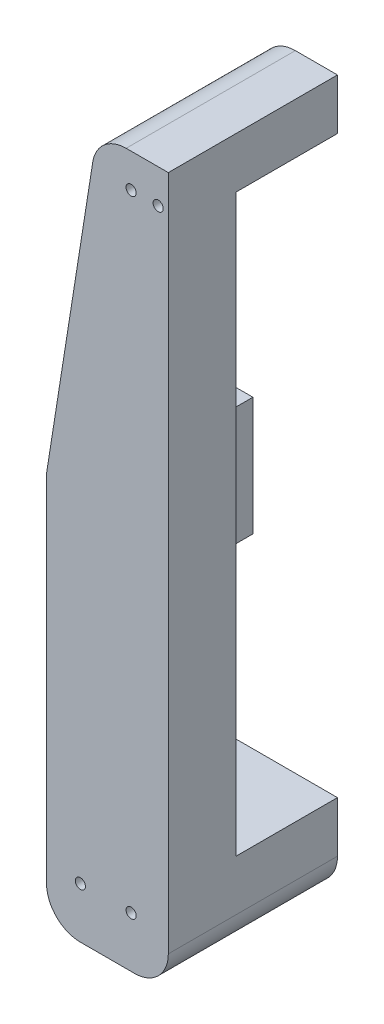
ISO-10303-21;
HEADER;
FILE_DESCRIPTION(('STEP AP214'),'2;1');
FILE_NAME('part.step','',(''),(''),'','','');
FILE_SCHEMA(('AUTOMOTIVE_DESIGN { 1 0 10303 214 1 1 1 1 }'));
ENDSEC;
DATA;
#1=APPLICATION_CONTEXT('core data for automotive mechanical design processes');
#2=APPLICATION_PROTOCOL_DEFINITION('international standard','automotive_design',2000,#1);
#3=PRODUCT_CONTEXT('',#1,'mechanical');
#4=PRODUCT('Part','Part','',(#3));
#5=PRODUCT_RELATED_PRODUCT_CATEGORY('part','',(#4));
#6=PRODUCT_DEFINITION_FORMATION('','',#4);
#7=PRODUCT_DEFINITION_CONTEXT('part definition',#1,'design');
#8=PRODUCT_DEFINITION('design','',#6,#7);
#9=PRODUCT_DEFINITION_SHAPE('','',#8);
#10=(LENGTH_UNIT() NAMED_UNIT(*) SI_UNIT(.MILLI.,.METRE.));
#11=(NAMED_UNIT(*) PLANE_ANGLE_UNIT() SI_UNIT($,.RADIAN.));
#12=(NAMED_UNIT(*) SI_UNIT($,.STERADIAN.) SOLID_ANGLE_UNIT());
#13=UNCERTAINTY_MEASURE_WITH_UNIT(LENGTH_MEASURE(1.E-05),#10,'distance_accuracy_value','');
#14=(GEOMETRIC_REPRESENTATION_CONTEXT(3) GLOBAL_UNCERTAINTY_ASSIGNED_CONTEXT((#13)) GLOBAL_UNIT_ASSIGNED_CONTEXT((#10,
#11,#12)) REPRESENTATION_CONTEXT('',''));
#15=CARTESIAN_POINT('',(0.,0.,0.));
#16=DIRECTION('',(0.,0.,1.));
#17=DIRECTION('',(1.,0.,0.));
#18=AXIS2_PLACEMENT_3D('',#15,#16,#17);
#19=CARTESIAN_POINT('',(0.,0.,0.));
#20=DIRECTION('',(0.,0.,1.));
#21=DIRECTION('',(1.,0.,0.));
#22=AXIS2_PLACEMENT_3D('',#19,#20,#21);
#23=PLANE('',#22);
#24=CARTESIAN_POINT('',(0.,0.,0.));
#25=DIRECTION('',(0.,0.,1.));
#26=DIRECTION('',(1.,0.,0.));
#27=AXIS2_PLACEMENT_3D('',#24,#25,#26);
#28=CIRCLE('',#27,1.5);
#29=CARTESIAN_POINT('',(1.5,0.,0.));
#30=VERTEX_POINT('',#29);
#31=EDGE_CURVE('E223',#30,#30,#28,.T.);
#32=ORIENTED_EDGE('',*,*,#31,.T.);
#33=EDGE_LOOP('',(#32));
#34=FACE_BOUND('',#33,.T.);
#35=CARTESIAN_POINT('',(8.,0.,0.));
#36=DIRECTION('',(0.,0.,1.));
#37=DIRECTION('',(1.,0.,0.));
#38=AXIS2_PLACEMENT_3D('',#35,#36,#37);
#39=CIRCLE('',#38,1.5);
#40=CARTESIAN_POINT('',(9.5,0.,0.));
#41=VERTEX_POINT('',#40);
#42=EDGE_CURVE('E206',#41,#41,#39,.T.);
#43=ORIENTED_EDGE('',*,*,#42,.T.);
#44=EDGE_LOOP('',(#43));
#45=FACE_BOUND('',#44,.T.);
#46=DIRECTION('',(-0.155962573473011,-0.987762965329069,0.));
#47=VECTOR('',#46,1.);
#48=CARTESIAN_POINT('',(-25.,-85.,0.));
#49=LINE('',#48,#47);
#50=CARTESIAN_POINT('',(-11.3326906734637,1.55962573473008,0.));
#51=VERTEX_POINT('',#50);
#52=CARTESIAN_POINT('',(-12.3684210526316,-5.00000000000003,0.));
#53=VERTEX_POINT('',#52);
#54=EDGE_CURVE('E249',#51,#53,#49,.T.);
#55=ORIENTED_EDGE('',*,*,#54,.F.);
#56=CARTESIAN_POINT('',(-1.45506102017298,0.,0.));
#57=DIRECTION('',(0.,0.,1.));
#58=DIRECTION('',(1.,0.,0.));
#59=AXIS2_PLACEMENT_3D('',#56,#57,#58);
#60=CIRCLE('',#59,10.);
#61=CARTESIAN_POINT('',(-1.45506102017298,10.,0.));
#62=VERTEX_POINT('',#61);
#63=EDGE_CURVE('E281',#51,#62,#60,.F.);
#64=ORIENTED_EDGE('',*,*,#63,.T.);
#65=DIRECTION('',(-1.,0.,0.));
#66=VECTOR('',#65,1.);
#67=CARTESIAN_POINT('',(11.,10.,0.));
#68=LINE('',#67,#66);
#69=CARTESIAN_POINT('',(11.,10.,0.));
#70=VERTEX_POINT('',#69);
#71=EDGE_CURVE('E229',#70,#62,#68,.T.);
#72=ORIENTED_EDGE('',*,*,#71,.F.);
#73=DIRECTION('',(0.,1.,0.));
#74=VECTOR('',#73,1.);
#75=CARTESIAN_POINT('',(11.,10.,0.));
#76=LINE('',#75,#74);
#77=CARTESIAN_POINT('',(11.,-5.,0.));
#78=VERTEX_POINT('',#77);
#79=EDGE_CURVE('E260',#78,#70,#76,.T.);
#80=ORIENTED_EDGE('',*,*,#79,.F.);
#81=DIRECTION('',(1.,0.,0.));
#82=VECTOR('',#81,1.);
#83=CARTESIAN_POINT('',(-25.001,-5.00000000000001,0.));
#84=LINE('',#83,#82);
#85=EDGE_CURVE('E191',#53,#78,#84,.T.);
#86=ORIENTED_EDGE('',*,*,#85,.F.);
#87=EDGE_LOOP('',(#55,#64,#72,#80,#86));
#88=FACE_BOUND('',#87,.T.);
#89=ADVANCED_FACE('F39',(#34,#45,#88),#23,.F.);
#90=CARTESIAN_POINT('',(-25.,-85.,50.));
#91=DIRECTION('',(0.987762965329069,-0.155962573473011,0.));
#92=DIRECTION('',(0.155962573473011,0.987762965329069,0.));
#93=AXIS2_PLACEMENT_3D('',#90,#91,#92);
#94=PLANE('',#93);
#95=DIRECTION('',(-0.155962573473011,-0.987762965329069,0.));
#96=VECTOR('',#95,1.);
#97=CARTESIAN_POINT('',(-25.,-85.,50.));
#98=LINE('',#97,#96);
#99=CARTESIAN_POINT('',(-11.3326906734637,1.55962573473008,50.));
#100=VERTEX_POINT('',#99);
#101=CARTESIAN_POINT('',(-25.,-85.,50.));
#102=VERTEX_POINT('',#101);
#103=EDGE_CURVE('E236',#100,#102,#98,.T.);
#104=ORIENTED_EDGE('',*,*,#103,.F.);
#105=DIRECTION('',(0.,0.,-1.));
#106=VECTOR('',#105,1.);
#107=CARTESIAN_POINT('',(-11.3326906734637,1.55962573473012,50.));
#108=LINE('',#107,#106);
#109=EDGE_CURVE('E278',#100,#51,#108,.T.);
#110=ORIENTED_EDGE('',*,*,#109,.T.);
#111=ORIENTED_EDGE('',*,*,#54,.T.);
#112=DIRECTION('',(0.,0.,-1.));
#113=VECTOR('',#112,1.);
#114=CARTESIAN_POINT('',(-12.3684210526316,-5.00000000000001,0.));
#115=LINE('',#114,#113);
#116=CARTESIAN_POINT('',(-12.3684210526316,-5.,30.));
#117=VERTEX_POINT('',#116);
#118=EDGE_CURVE('E196',#117,#53,#115,.T.);
#119=ORIENTED_EDGE('',*,*,#118,.F.);
#120=DIRECTION('',(0.155962573473011,0.987762965329069,0.));
#121=VECTOR('',#120,1.);
#122=CARTESIAN_POINT('',(-12.6757,-6.94610000000001,30.));
#123=LINE('',#122,#121);
#124=CARTESIAN_POINT('',(-25.,-85.,30.));
#125=VERTEX_POINT('',#124);
#126=EDGE_CURVE('E174',#125,#117,#123,.T.);
#127=ORIENTED_EDGE('',*,*,#126,.F.);
#128=DIRECTION('',(0.,0.,-1.));
#129=VECTOR('',#128,1.);
#130=CARTESIAN_POINT('',(-25.,-85.,50.));
#131=LINE('',#130,#129);
#132=EDGE_CURVE('E172',#102,#125,#131,.T.);
#133=ORIENTED_EDGE('',*,*,#132,.F.);
#134=EDGE_LOOP('',(#104,#110,#111,#119,#127,#133));
#135=FACE_BOUND('',#134,.T.);
#136=ADVANCED_FACE('F297',(#135),#94,.F.);
#137=CARTESIAN_POINT('',(-25.,-85.,50.));
#138=DIRECTION('',(1.,0.,0.));
#139=DIRECTION('',(0.,1.,0.));
#140=AXIS2_PLACEMENT_3D('',#137,#138,#139);
#141=PLANE('',#140);
#142=DIRECTION('',(0.,-1.,0.));
#143=VECTOR('',#142,1.);
#144=CARTESIAN_POINT('',(-25.,-85.,0.));
#145=LINE('',#144,#143);
#146=CARTESIAN_POINT('',(-25.,-175.,0.));
#147=VERTEX_POINT('',#146);
#148=CARTESIAN_POINT('',(-25.,-190.,0.));
#149=VERTEX_POINT('',#148);
#150=EDGE_CURVE('E255',#147,#149,#145,.T.);
#151=ORIENTED_EDGE('',*,*,#150,.T.);
#152=DIRECTION('',(0.,0.,-1.));
#153=VECTOR('',#152,1.);
#154=CARTESIAN_POINT('',(-25.,-190.,50.));
#155=LINE('',#154,#153);
#156=CARTESIAN_POINT('',(-25.,-190.,50.));
#157=VERTEX_POINT('',#156);
#158=EDGE_CURVE('E279',#149,#157,#155,.F.);
#159=ORIENTED_EDGE('',*,*,#158,.T.);
#160=DIRECTION('',(0.,-1.,0.));
#161=VECTOR('',#160,1.);
#162=CARTESIAN_POINT('',(-25.,-85.,50.));
#163=LINE('',#162,#161);
#164=EDGE_CURVE('E237',#102,#157,#163,.T.);
#165=ORIENTED_EDGE('',*,*,#164,.F.);
#166=ORIENTED_EDGE('',*,*,#132,.T.);
#167=DIRECTION('',(0.,0.,1.));
#168=VECTOR('',#167,1.);
#169=CARTESIAN_POINT('',(-25.,-85.,0.));
#170=LINE('',#169,#168);
#171=CARTESIAN_POINT('',(-25.,-85.,0.));
#172=VERTEX_POINT('',#171);
#173=EDGE_CURVE('E153',#172,#125,#170,.T.);
#174=ORIENTED_EDGE('',*,*,#173,.F.);
#175=DIRECTION('',(0.,1.,0.));
#176=VECTOR('',#175,1.);
#177=CARTESIAN_POINT('',(-25.,-85.,0.));
#178=LINE('',#177,#176);
#179=CARTESIAN_POINT('',(-25.,-120.,0.));
#180=VERTEX_POINT('',#179);
#181=EDGE_CURVE('E160',#180,#172,#178,.T.);
#182=ORIENTED_EDGE('',*,*,#181,.F.);
#183=DIRECTION('',(0.,0.,1.));
#184=VECTOR('',#183,1.);
#185=CARTESIAN_POINT('',(-25.,-120.,0.));
#186=LINE('',#185,#184);
#187=CARTESIAN_POINT('',(-25.,-120.,30.));
#188=VERTEX_POINT('',#187);
#189=EDGE_CURVE('E340',#180,#188,#186,.T.);
#190=ORIENTED_EDGE('',*,*,#189,.T.);
#191=DIRECTION('',(0.,1.,0.));
#192=VECTOR('',#191,1.);
#193=CARTESIAN_POINT('',(-25.,-5.00000000000001,30.));
#194=LINE('',#193,#192);
#195=CARTESIAN_POINT('',(-25.,-175.,30.));
#196=VERTEX_POINT('',#195);
#197=EDGE_CURVE('E58',#196,#188,#194,.T.);
#198=ORIENTED_EDGE('',*,*,#197,.F.);
#199=DIRECTION('',(0.,0.,1.));
#200=VECTOR('',#199,1.);
#201=CARTESIAN_POINT('',(-25.,-175.,0.));
#202=LINE('',#201,#200);
#203=EDGE_CURVE('E178',#147,#196,#202,.T.);
#204=ORIENTED_EDGE('',*,*,#203,.F.);
#205=EDGE_LOOP('',(#151,#159,#165,#166,#174,#182,#190,#198,#204));
#206=FACE_BOUND('',#205,.T.);
#207=ADVANCED_FACE('F171',(#206),#141,.F.);
#208=CARTESIAN_POINT('',(11.,10.,50.));
#209=DIRECTION('',(-1.,0.,0.));
#210=DIRECTION('',(0.,-1.,0.));
#211=AXIS2_PLACEMENT_3D('',#208,#209,#210);
#212=PLANE('',#211);
#213=DIRECTION('',(0.,1.,0.));
#214=VECTOR('',#213,1.);
#215=CARTESIAN_POINT('',(11.,10.,50.));
#216=LINE('',#215,#214);
#217=CARTESIAN_POINT('',(11.,-190.,50.));
#218=VERTEX_POINT('',#217);
#219=CARTESIAN_POINT('',(11.,10.,50.));
#220=VERTEX_POINT('',#219);
#221=EDGE_CURVE('E244',#218,#220,#216,.T.);
#222=ORIENTED_EDGE('',*,*,#221,.F.);
#223=DIRECTION('',(0.,0.,-1.));
#224=VECTOR('',#223,1.);
#225=CARTESIAN_POINT('',(11.,-190.,50.));
#226=LINE('',#225,#224);
#227=CARTESIAN_POINT('',(11.,-190.,0.));
#228=VERTEX_POINT('',#227);
#229=EDGE_CURVE('E265',#218,#228,#226,.T.);
#230=ORIENTED_EDGE('',*,*,#229,.T.);
#231=CARTESIAN_POINT('',(11.,-175.,0.));
#232=VERTEX_POINT('',#231);
#233=EDGE_CURVE('E240',#228,#232,#76,.T.);
#234=ORIENTED_EDGE('',*,*,#233,.T.);
#235=DIRECTION('',(0.,0.,-1.));
#236=VECTOR('',#235,1.);
#237=CARTESIAN_POINT('',(11.,-175.,0.));
#238=LINE('',#237,#236);
#239=CARTESIAN_POINT('',(11.,-175.,30.));
#240=VERTEX_POINT('',#239);
#241=EDGE_CURVE('E192',#240,#232,#238,.T.);
#242=ORIENTED_EDGE('',*,*,#241,.F.);
#243=DIRECTION('',(0.,-1.,0.));
#244=VECTOR('',#243,1.);
#245=CARTESIAN_POINT('',(11.,-5.,30.));
#246=LINE('',#245,#244);
#247=CARTESIAN_POINT('',(11.,-5.,30.));
#248=VERTEX_POINT('',#247);
#249=EDGE_CURVE('E189',#248,#240,#246,.T.);
#250=ORIENTED_EDGE('',*,*,#249,.F.);
#251=DIRECTION('',(0.,0.,1.));
#252=VECTOR('',#251,1.);
#253=CARTESIAN_POINT('',(11.,-5.,0.));
#254=LINE('',#253,#252);
#255=EDGE_CURVE('E187',#78,#248,#254,.T.);
#256=ORIENTED_EDGE('',*,*,#255,.F.);
#257=ORIENTED_EDGE('',*,*,#79,.T.);
#258=DIRECTION('',(0.,0.,-1.));
#259=VECTOR('',#258,1.);
#260=CARTESIAN_POINT('',(11.,10.,50.));
#261=LINE('',#260,#259);
#262=EDGE_CURVE('E250',#220,#70,#261,.T.);
#263=ORIENTED_EDGE('',*,*,#262,.F.);
#264=EDGE_LOOP('',(#222,#230,#234,#242,#250,#256,#257,#263));
#265=FACE_BOUND('',#264,.T.);
#266=ADVANCED_FACE('F309',(#265),#212,.F.);
#267=CARTESIAN_POINT('',(0.,0.,50.));
#268=DIRECTION('',(0.,0.,1.));
#269=DIRECTION('',(1.,0.,0.));
#270=AXIS2_PLACEMENT_3D('',#267,#268,#269);
#271=PLANE('',#270);
#272=CARTESIAN_POINT('',(-15.,-185.,50.));
#273=DIRECTION('',(0.,0.,1.));
#274=DIRECTION('',(1.,0.,0.));
#275=AXIS2_PLACEMENT_3D('',#272,#273,#274);
#276=CIRCLE('',#275,1.5);
#277=CARTESIAN_POINT('',(-13.5,-185.,50.));
#278=VERTEX_POINT('',#277);
#279=EDGE_CURVE('E213',#278,#278,#276,.T.);
#280=ORIENTED_EDGE('',*,*,#279,.F.);
#281=EDGE_LOOP('',(#280));
#282=FACE_BOUND('',#281,.T.);
#283=CARTESIAN_POINT('',(0.,0.,50.));
#284=DIRECTION('',(0.,0.,1.));
#285=DIRECTION('',(1.,0.,0.));
#286=AXIS2_PLACEMENT_3D('',#283,#284,#285);
#287=CIRCLE('',#286,1.5);
#288=CARTESIAN_POINT('',(1.5,0.,50.));
#289=VERTEX_POINT('',#288);
#290=EDGE_CURVE('E227',#289,#289,#287,.T.);
#291=ORIENTED_EDGE('',*,*,#290,.F.);
#292=EDGE_LOOP('',(#291));
#293=FACE_BOUND('',#292,.T.);
#294=DIRECTION('',(-1.,0.,0.));
#295=VECTOR('',#294,1.);
#296=CARTESIAN_POINT('',(11.,10.,50.));
#297=LINE('',#296,#295);
#298=CARTESIAN_POINT('',(-1.45506102017298,10.,50.));
#299=VERTEX_POINT('',#298);
#300=EDGE_CURVE('E231',#220,#299,#297,.T.);
#301=ORIENTED_EDGE('',*,*,#300,.T.);
#302=CARTESIAN_POINT('',(-1.45506102017298,0.,50.));
#303=DIRECTION('',(0.,0.,1.));
#304=DIRECTION('',(1.,0.,0.));
#305=AXIS2_PLACEMENT_3D('',#302,#303,#304);
#306=CIRCLE('',#305,10.);
#307=EDGE_CURVE('E11',#299,#100,#306,.T.);
#308=ORIENTED_EDGE('',*,*,#307,.T.);
#309=ORIENTED_EDGE('',*,*,#103,.T.);
#310=ORIENTED_EDGE('',*,*,#164,.T.);
#311=CARTESIAN_POINT('',(-15.,-190.,50.));
#312=DIRECTION('',(0.,0.,1.));
#313=DIRECTION('',(1.,0.,0.));
#314=AXIS2_PLACEMENT_3D('',#311,#312,#313);
#315=CIRCLE('',#314,10.);
#316=CARTESIAN_POINT('',(-15.,-200.,50.));
#317=VERTEX_POINT('',#316);
#318=EDGE_CURVE('E274',#157,#317,#315,.T.);
#319=ORIENTED_EDGE('',*,*,#318,.T.);
#320=DIRECTION('',(1.,0.,0.));
#321=VECTOR('',#320,1.);
#322=CARTESIAN_POINT('',(11.,-200.,50.));
#323=LINE('',#322,#321);
#324=CARTESIAN_POINT('',(1.00000000000002,-200.,50.));
#325=VERTEX_POINT('',#324);
#326=EDGE_CURVE('E245',#317,#325,#323,.T.);
#327=ORIENTED_EDGE('',*,*,#326,.T.);
#328=CARTESIAN_POINT('',(1.00000000000002,-190.,50.));
#329=DIRECTION('',(0.,0.,1.));
#330=DIRECTION('',(1.,0.,0.));
#331=AXIS2_PLACEMENT_3D('',#328,#329,#330);
#332=CIRCLE('',#331,10.);
#333=EDGE_CURVE('E277',#325,#218,#332,.T.);
#334=ORIENTED_EDGE('',*,*,#333,.T.);
#335=ORIENTED_EDGE('',*,*,#221,.T.);
#336=EDGE_LOOP('',(#301,#308,#309,#310,#319,#327,#334,#335));
#337=FACE_BOUND('',#336,.T.);
#338=CARTESIAN_POINT('',(0.,-185.,50.));
#339=DIRECTION('',(0.,0.,1.));
#340=DIRECTION('',(1.,0.,0.));
#341=AXIS2_PLACEMENT_3D('',#338,#339,#340);
#342=CIRCLE('',#341,1.5);
#343=CARTESIAN_POINT('',(1.50000000000002,-185.,50.));
#344=VERTEX_POINT('',#343);
#345=EDGE_CURVE('E221',#344,#344,#342,.T.);
#346=ORIENTED_EDGE('',*,*,#345,.F.);
#347=EDGE_LOOP('',(#346));
#348=FACE_BOUND('',#347,.T.);
#349=CARTESIAN_POINT('',(8.,0.,50.));
#350=DIRECTION('',(0.,0.,1.));
#351=DIRECTION('',(1.,0.,0.));
#352=AXIS2_PLACEMENT_3D('',#349,#350,#351);
#353=CIRCLE('',#352,1.5);
#354=CARTESIAN_POINT('',(9.5,0.,50.));
#355=VERTEX_POINT('',#354);
#356=EDGE_CURVE('E209',#355,#355,#353,.T.);
#357=ORIENTED_EDGE('',*,*,#356,.F.);
#358=EDGE_LOOP('',(#357));
#359=FACE_BOUND('',#358,.T.);
#360=ADVANCED_FACE('F292',(#282,#293,#337,#348,#359),#271,.T.);
#361=ORIENTED_EDGE('',*,*,#233,.F.);
#362=CARTESIAN_POINT('',(1.00000000000002,-190.,0.));
#363=DIRECTION('',(0.,0.,1.));
#364=DIRECTION('',(1.,0.,0.));
#365=AXIS2_PLACEMENT_3D('',#362,#363,#364);
#366=CIRCLE('',#365,10.);
#367=CARTESIAN_POINT('',(1.00000000000002,-200.,0.));
#368=VERTEX_POINT('',#367);
#369=EDGE_CURVE('E270',#228,#368,#366,.F.);
#370=ORIENTED_EDGE('',*,*,#369,.T.);
#371=DIRECTION('',(1.,0.,0.));
#372=VECTOR('',#371,1.);
#373=CARTESIAN_POINT('',(11.,-200.,0.));
#374=LINE('',#373,#372);
#375=CARTESIAN_POINT('',(-15.,-200.,0.));
#376=VERTEX_POINT('',#375);
#377=EDGE_CURVE('E251',#376,#368,#374,.T.);
#378=ORIENTED_EDGE('',*,*,#377,.F.);
#379=CARTESIAN_POINT('',(-15.,-190.,0.));
#380=DIRECTION('',(0.,0.,1.));
#381=DIRECTION('',(1.,0.,0.));
#382=AXIS2_PLACEMENT_3D('',#379,#380,#381);
#383=CIRCLE('',#382,10.);
#384=EDGE_CURVE('E262',#376,#149,#383,.F.);
#385=ORIENTED_EDGE('',*,*,#384,.T.);
#386=ORIENTED_EDGE('',*,*,#150,.F.);
#387=DIRECTION('',(1.,0.,0.));
#388=VECTOR('',#387,1.);
#389=CARTESIAN_POINT('',(-25.001,-175.,0.));
#390=LINE('',#389,#388);
#391=EDGE_CURVE('E193',#147,#232,#390,.T.);
#392=ORIENTED_EDGE('',*,*,#391,.T.);
#393=EDGE_LOOP('',(#361,#370,#378,#385,#386,#392));
#394=FACE_BOUND('',#393,.T.);
#395=CARTESIAN_POINT('',(0.,-185.,0.));
#396=DIRECTION('',(0.,0.,1.));
#397=DIRECTION('',(1.,0.,0.));
#398=AXIS2_PLACEMENT_3D('',#395,#396,#397);
#399=CIRCLE('',#398,1.5);
#400=CARTESIAN_POINT('',(1.50000000000002,-185.,0.));
#401=VERTEX_POINT('',#400);
#402=EDGE_CURVE('E216',#401,#401,#399,.T.);
#403=ORIENTED_EDGE('',*,*,#402,.T.);
#404=EDGE_LOOP('',(#403));
#405=FACE_BOUND('',#404,.T.);
#406=CARTESIAN_POINT('',(-15.,-185.,0.));
#407=DIRECTION('',(0.,0.,1.));
#408=DIRECTION('',(1.,0.,0.));
#409=AXIS2_PLACEMENT_3D('',#406,#407,#408);
#410=CIRCLE('',#409,1.5);
#411=CARTESIAN_POINT('',(-13.5,-185.,0.));
#412=VERTEX_POINT('',#411);
#413=EDGE_CURVE('E215',#412,#412,#410,.T.);
#414=ORIENTED_EDGE('',*,*,#413,.T.);
#415=EDGE_LOOP('',(#414));
#416=FACE_BOUND('',#415,.T.);
#417=ADVANCED_FACE('F330',(#394,#405,#416),#23,.F.);
#418=CARTESIAN_POINT('',(11.,10.,50.));
#419=DIRECTION('',(0.,-1.,0.));
#420=DIRECTION('',(1.,0.,0.));
#421=AXIS2_PLACEMENT_3D('',#418,#419,#420);
#422=PLANE('',#421);
#423=ORIENTED_EDGE('',*,*,#71,.T.);
#424=DIRECTION('',(0.,0.,-1.));
#425=VECTOR('',#424,1.);
#426=CARTESIAN_POINT('',(-1.45506102017298,10.,50.));
#427=LINE('',#426,#425);
#428=EDGE_CURVE('E50',#62,#299,#427,.F.);
#429=ORIENTED_EDGE('',*,*,#428,.T.);
#430=ORIENTED_EDGE('',*,*,#300,.F.);
#431=ORIENTED_EDGE('',*,*,#262,.T.);
#432=EDGE_LOOP('',(#423,#429,#430,#431));
#433=FACE_BOUND('',#432,.T.);
#434=ADVANCED_FACE('F290',(#433),#422,.F.);
#435=CARTESIAN_POINT('',(11.,-200.,50.));
#436=DIRECTION('',(0.,1.,0.));
#437=DIRECTION('',(0.,0.,1.));
#438=AXIS2_PLACEMENT_3D('',#435,#436,#437);
#439=PLANE('',#438);
#440=ORIENTED_EDGE('',*,*,#377,.T.);
#441=DIRECTION('',(0.,0.,-1.));
#442=VECTOR('',#441,1.);
#443=CARTESIAN_POINT('',(1.00000000000002,-200.,50.));
#444=LINE('',#443,#442);
#445=EDGE_CURVE('E275',#368,#325,#444,.F.);
#446=ORIENTED_EDGE('',*,*,#445,.T.);
#447=ORIENTED_EDGE('',*,*,#326,.F.);
#448=DIRECTION('',(0.,0.,-1.));
#449=VECTOR('',#448,1.);
#450=CARTESIAN_POINT('',(-15.,-200.,50.));
#451=LINE('',#450,#449);
#452=EDGE_CURVE('E268',#317,#376,#451,.T.);
#453=ORIENTED_EDGE('',*,*,#452,.T.);
#454=EDGE_LOOP('',(#440,#446,#447,#453));
#455=FACE_BOUND('',#454,.T.);
#456=ADVANCED_FACE('F324',(#455),#439,.F.);
#457=CARTESIAN_POINT('',(0.,0.,50.));
#458=DIRECTION('',(0.,0.,-1.));
#459=DIRECTION('',(-1.,0.,0.));
#460=AXIS2_PLACEMENT_3D('',#457,#458,#459);
#461=CYLINDRICAL_SURFACE('',#460,1.5);
#462=ORIENTED_EDGE('',*,*,#290,.T.);
#463=EDGE_LOOP('',(#462));
#464=FACE_BOUND('',#463,.T.);
#465=ORIENTED_EDGE('',*,*,#31,.F.);
#466=EDGE_LOOP('',(#465));
#467=FACE_BOUND('',#466,.T.);
#468=ADVANCED_FACE('F398',(#464,#467),#461,.F.);
#469=CARTESIAN_POINT('',(0.,-185.,50.));
#470=DIRECTION('',(0.,0.,-1.));
#471=DIRECTION('',(-1.,0.,0.));
#472=AXIS2_PLACEMENT_3D('',#469,#470,#471);
#473=CYLINDRICAL_SURFACE('',#472,1.5);
#474=ORIENTED_EDGE('',*,*,#345,.T.);
#475=EDGE_LOOP('',(#474));
#476=FACE_BOUND('',#475,.T.);
#477=ORIENTED_EDGE('',*,*,#402,.F.);
#478=EDGE_LOOP('',(#477));
#479=FACE_BOUND('',#478,.T.);
#480=ADVANCED_FACE('F405',(#476,#479),#473,.F.);
#481=CARTESIAN_POINT('',(-15.,-185.,50.));
#482=DIRECTION('',(0.,0.,-1.));
#483=DIRECTION('',(-1.,0.,0.));
#484=AXIS2_PLACEMENT_3D('',#481,#482,#483);
#485=CYLINDRICAL_SURFACE('',#484,1.5);
#486=ORIENTED_EDGE('',*,*,#279,.T.);
#487=EDGE_LOOP('',(#486));
#488=FACE_BOUND('',#487,.T.);
#489=ORIENTED_EDGE('',*,*,#413,.F.);
#490=EDGE_LOOP('',(#489));
#491=FACE_BOUND('',#490,.T.);
#492=ADVANCED_FACE('F407',(#488,#491),#485,.F.);
#493=CARTESIAN_POINT('',(8.,0.,50.));
#494=DIRECTION('',(0.,0.,-1.));
#495=DIRECTION('',(-1.,0.,0.));
#496=AXIS2_PLACEMENT_3D('',#493,#494,#495);
#497=CYLINDRICAL_SURFACE('',#496,1.5);
#498=ORIENTED_EDGE('',*,*,#356,.T.);
#499=EDGE_LOOP('',(#498));
#500=FACE_BOUND('',#499,.T.);
#501=ORIENTED_EDGE('',*,*,#42,.F.);
#502=EDGE_LOOP('',(#501));
#503=FACE_BOUND('',#502,.T.);
#504=ADVANCED_FACE('F408',(#500,#503),#497,.F.);
#505=CARTESIAN_POINT('',(-25.001,-175.,0.));
#506=DIRECTION('',(0.,-1.,0.));
#507=DIRECTION('',(1.,0.,0.));
#508=AXIS2_PLACEMENT_3D('',#505,#506,#507);
#509=PLANE('',#508);
#510=ORIENTED_EDGE('',*,*,#203,.T.);
#511=DIRECTION('',(1.,0.,0.));
#512=VECTOR('',#511,1.);
#513=CARTESIAN_POINT('',(-25.001,-175.,30.));
#514=LINE('',#513,#512);
#515=EDGE_CURVE('E199',#196,#240,#514,.T.);
#516=ORIENTED_EDGE('',*,*,#515,.T.);
#517=ORIENTED_EDGE('',*,*,#241,.T.);
#518=ORIENTED_EDGE('',*,*,#391,.F.);
#519=EDGE_LOOP('',(#510,#516,#517,#518));
#520=FACE_BOUND('',#519,.T.);
#521=ADVANCED_FACE('F334',(#520),#509,.F.);
#522=CARTESIAN_POINT('',(-25.001,-5.00000000000001,30.));
#523=DIRECTION('',(0.,0.,1.));
#524=DIRECTION('',(0.,-1.,0.));
#525=AXIS2_PLACEMENT_3D('',#522,#523,#524);
#526=PLANE('',#525);
#527=DIRECTION('',(-1.,0.,0.));
#528=VECTOR('',#527,1.);
#529=CARTESIAN_POINT('',(-25.,-120.,30.));
#530=LINE('',#529,#528);
#531=CARTESIAN_POINT('',(-14.,-120.,30.));
#532=VERTEX_POINT('',#531);
#533=EDGE_CURVE('E170',#532,#188,#530,.T.);
#534=ORIENTED_EDGE('',*,*,#533,.F.);
#535=DIRECTION('',(0.,-1.,0.));
#536=VECTOR('',#535,1.);
#537=CARTESIAN_POINT('',(-14.,-85.,30.));
#538=LINE('',#537,#536);
#539=CARTESIAN_POINT('',(-14.,-85.,30.));
#540=VERTEX_POINT('',#539);
#541=EDGE_CURVE('E53',#540,#532,#538,.T.);
#542=ORIENTED_EDGE('',*,*,#541,.F.);
#543=DIRECTION('',(1.,0.,0.));
#544=VECTOR('',#543,1.);
#545=CARTESIAN_POINT('',(-25.,-85.,30.));
#546=LINE('',#545,#544);
#547=EDGE_CURVE('E313',#125,#540,#546,.T.);
#548=ORIENTED_EDGE('',*,*,#547,.F.);
#549=ORIENTED_EDGE('',*,*,#126,.T.);
#550=DIRECTION('',(1.,0.,0.));
#551=VECTOR('',#550,1.);
#552=CARTESIAN_POINT('',(-25.001,-5.00000000000001,30.));
#553=LINE('',#552,#551);
#554=EDGE_CURVE('E201',#117,#248,#553,.T.);
#555=ORIENTED_EDGE('',*,*,#554,.T.);
#556=ORIENTED_EDGE('',*,*,#249,.T.);
#557=ORIENTED_EDGE('',*,*,#515,.F.);
#558=ORIENTED_EDGE('',*,*,#197,.T.);
#559=EDGE_LOOP('',(#534,#542,#548,#549,#555,#556,#557,#558));
#560=FACE_BOUND('',#559,.T.);
#561=ADVANCED_FACE('F315',(#560),#526,.F.);
#562=CARTESIAN_POINT('',(-25.001,-5.00000000000001,0.));
#563=DIRECTION('',(0.,1.,0.));
#564=DIRECTION('',(-1.,0.,0.));
#565=AXIS2_PLACEMENT_3D('',#562,#563,#564);
#566=PLANE('',#565);
#567=ORIENTED_EDGE('',*,*,#118,.T.);
#568=ORIENTED_EDGE('',*,*,#85,.T.);
#569=ORIENTED_EDGE('',*,*,#255,.T.);
#570=ORIENTED_EDGE('',*,*,#554,.F.);
#571=EDGE_LOOP('',(#567,#568,#569,#570));
#572=FACE_BOUND('',#571,.T.);
#573=ADVANCED_FACE('F310',(#572),#566,.F.);
#574=CARTESIAN_POINT('',(1.00000000000002,-190.,50.));
#575=DIRECTION('',(0.,0.,-1.));
#576=DIRECTION('',(-1.,0.,0.));
#577=AXIS2_PLACEMENT_3D('',#574,#575,#576);
#578=CYLINDRICAL_SURFACE('',#577,10.);
#579=ORIENTED_EDGE('',*,*,#333,.F.);
#580=ORIENTED_EDGE('',*,*,#445,.F.);
#581=ORIENTED_EDGE('',*,*,#369,.F.);
#582=ORIENTED_EDGE('',*,*,#229,.F.);
#583=EDGE_LOOP('',(#579,#580,#581,#582));
#584=FACE_BOUND('',#583,.T.);
#585=ADVANCED_FACE('F332',(#584),#578,.T.);
#586=CARTESIAN_POINT('',(-15.,-190.,50.));
#587=DIRECTION('',(0.,0.,-1.));
#588=DIRECTION('',(-1.,0.,0.));
#589=AXIS2_PLACEMENT_3D('',#586,#587,#588);
#590=CYLINDRICAL_SURFACE('',#589,10.);
#591=ORIENTED_EDGE('',*,*,#318,.F.);
#592=ORIENTED_EDGE('',*,*,#158,.F.);
#593=ORIENTED_EDGE('',*,*,#384,.F.);
#594=ORIENTED_EDGE('',*,*,#452,.F.);
#595=EDGE_LOOP('',(#591,#592,#593,#594));
#596=FACE_BOUND('',#595,.T.);
#597=ADVANCED_FACE('F318',(#596),#590,.T.);
#598=CARTESIAN_POINT('',(-1.45506102017298,0.,50.));
#599=DIRECTION('',(0.,0.,-1.));
#600=DIRECTION('',(-1.,0.,0.));
#601=AXIS2_PLACEMENT_3D('',#598,#599,#600);
#602=CYLINDRICAL_SURFACE('',#601,10.);
#603=ORIENTED_EDGE('',*,*,#307,.F.);
#604=ORIENTED_EDGE('',*,*,#428,.F.);
#605=ORIENTED_EDGE('',*,*,#63,.F.);
#606=ORIENTED_EDGE('',*,*,#109,.F.);
#607=EDGE_LOOP('',(#603,#604,#605,#606));
#608=FACE_BOUND('',#607,.T.);
#609=ADVANCED_FACE('F41',(#608),#602,.T.);
#610=CARTESIAN_POINT('',(0.,0.,0.));
#611=DIRECTION('',(0.,0.,1.));
#612=DIRECTION('',(0.,-1.,0.));
#613=AXIS2_PLACEMENT_3D('',#610,#611,#612);
#614=PLANE('',#613);
#615=ORIENTED_EDGE('',*,*,#181,.T.);
#616=DIRECTION('',(1.,0.,0.));
#617=VECTOR('',#616,1.);
#618=CARTESIAN_POINT('',(-25.,-85.,0.));
#619=LINE('',#618,#617);
#620=CARTESIAN_POINT('',(-14.,-85.,0.));
#621=VERTEX_POINT('',#620);
#622=EDGE_CURVE('E150',#172,#621,#619,.T.);
#623=ORIENTED_EDGE('',*,*,#622,.T.);
#624=DIRECTION('',(0.,-1.,0.));
#625=VECTOR('',#624,1.);
#626=CARTESIAN_POINT('',(-14.,-85.,0.));
#627=LINE('',#626,#625);
#628=CARTESIAN_POINT('',(-14.,-120.,0.));
#629=VERTEX_POINT('',#628);
#630=EDGE_CURVE('E156',#621,#629,#627,.T.);
#631=ORIENTED_EDGE('',*,*,#630,.T.);
#632=DIRECTION('',(-1.,0.,0.));
#633=VECTOR('',#632,1.);
#634=CARTESIAN_POINT('',(-25.,-120.,0.));
#635=LINE('',#634,#633);
#636=EDGE_CURVE('E161',#629,#180,#635,.T.);
#637=ORIENTED_EDGE('',*,*,#636,.T.);
#638=EDGE_LOOP('',(#615,#623,#631,#637));
#639=FACE_BOUND('',#638,.T.);
#640=CARTESIAN_POINT('',(-19.,-90.,0.));
#641=DIRECTION('',(0.,0.,-1.));
#642=DIRECTION('',(0.,1.,0.));
#643=AXIS2_PLACEMENT_3D('',#640,#641,#642);
#644=CIRCLE('',#643,1.5);
#645=CARTESIAN_POINT('',(-19.,-88.5,0.));
#646=VERTEX_POINT('',#645);
#647=EDGE_CURVE('E343',#646,#646,#644,.T.);
#648=ORIENTED_EDGE('',*,*,#647,.F.);
#649=EDGE_LOOP('',(#648));
#650=FACE_BOUND('',#649,.T.);
#651=CARTESIAN_POINT('',(-19.,-110.,0.));
#652=DIRECTION('',(0.,0.,-1.));
#653=DIRECTION('',(0.,1.,0.));
#654=AXIS2_PLACEMENT_3D('',#651,#652,#653);
#655=CIRCLE('',#654,1.5);
#656=CARTESIAN_POINT('',(-19.,-108.5,0.));
#657=VERTEX_POINT('',#656);
#658=EDGE_CURVE('E351',#657,#657,#655,.T.);
#659=ORIENTED_EDGE('',*,*,#658,.F.);
#660=EDGE_LOOP('',(#659));
#661=FACE_BOUND('',#660,.T.);
#662=ADVANCED_FACE('F159',(#639,#650,#661),#614,.F.);
#663=CARTESIAN_POINT('',(-25.,-85.,0.));
#664=DIRECTION('',(0.,-1.,0.));
#665=DIRECTION('',(0.,0.,-1.));
#666=AXIS2_PLACEMENT_3D('',#663,#664,#665);
#667=PLANE('',#666);
#668=ORIENTED_EDGE('',*,*,#547,.T.);
#669=DIRECTION('',(0.,0.,1.));
#670=VECTOR('',#669,1.);
#671=CARTESIAN_POINT('',(-14.,-85.,0.));
#672=LINE('',#671,#670);
#673=EDGE_CURVE('E151',#621,#540,#672,.T.);
#674=ORIENTED_EDGE('',*,*,#673,.F.);
#675=ORIENTED_EDGE('',*,*,#622,.F.);
#676=ORIENTED_EDGE('',*,*,#173,.T.);
#677=EDGE_LOOP('',(#668,#674,#675,#676));
#678=FACE_BOUND('',#677,.T.);
#679=ADVANCED_FACE('F146',(#678),#667,.F.);
#680=CARTESIAN_POINT('',(-14.,-85.,0.));
#681=DIRECTION('',(-1.,0.,0.));
#682=DIRECTION('',(0.,-1.,0.));
#683=AXIS2_PLACEMENT_3D('',#680,#681,#682);
#684=PLANE('',#683);
#685=ORIENTED_EDGE('',*,*,#541,.T.);
#686=DIRECTION('',(0.,0.,1.));
#687=VECTOR('',#686,1.);
#688=CARTESIAN_POINT('',(-14.,-120.,0.));
#689=LINE('',#688,#687);
#690=EDGE_CURVE('E179',#629,#532,#689,.T.);
#691=ORIENTED_EDGE('',*,*,#690,.F.);
#692=ORIENTED_EDGE('',*,*,#630,.F.);
#693=ORIENTED_EDGE('',*,*,#673,.T.);
#694=EDGE_LOOP('',(#685,#691,#692,#693));
#695=FACE_BOUND('',#694,.T.);
#696=ADVANCED_FACE('F367',(#695),#684,.F.);
#697=CARTESIAN_POINT('',(-25.,-120.,0.));
#698=DIRECTION('',(0.,1.,0.));
#699=DIRECTION('',(0.,0.,1.));
#700=AXIS2_PLACEMENT_3D('',#697,#698,#699);
#701=PLANE('',#700);
#702=ORIENTED_EDGE('',*,*,#533,.T.);
#703=ORIENTED_EDGE('',*,*,#189,.F.);
#704=ORIENTED_EDGE('',*,*,#636,.F.);
#705=ORIENTED_EDGE('',*,*,#690,.T.);
#706=EDGE_LOOP('',(#702,#703,#704,#705));
#707=FACE_BOUND('',#706,.T.);
#708=ADVANCED_FACE('F421',(#707),#701,.F.);
#709=CARTESIAN_POINT('',(-19.,-90.,0.));
#710=DIRECTION('',(0.,0.,1.));
#711=DIRECTION('',(0.,-1.,0.));
#712=AXIS2_PLACEMENT_3D('',#709,#710,#711);
#713=CYLINDRICAL_SURFACE('',#712,1.5);
#714=ORIENTED_EDGE('',*,*,#647,.T.);
#715=EDGE_LOOP('',(#714));
#716=FACE_BOUND('',#715,.T.);
#717=CARTESIAN_POINT('',(-19.,-90.,30.));
#718=DIRECTION('',(0.,0.,-1.));
#719=DIRECTION('',(0.,1.,0.));
#720=AXIS2_PLACEMENT_3D('',#717,#718,#719);
#721=CIRCLE('',#720,1.5);
#722=CARTESIAN_POINT('',(-19.,-88.5,30.));
#723=VERTEX_POINT('',#722);
#724=EDGE_CURVE('E346',#723,#723,#721,.T.);
#725=ORIENTED_EDGE('',*,*,#724,.F.);
#726=EDGE_LOOP('',(#725));
#727=FACE_BOUND('',#726,.T.);
#728=ADVANCED_FACE('F428',(#716,#727),#713,.F.);
#729=CARTESIAN_POINT('',(-19.,-110.,0.));
#730=DIRECTION('',(0.,0.,1.));
#731=DIRECTION('',(0.,-1.,0.));
#732=AXIS2_PLACEMENT_3D('',#729,#730,#731);
#733=CYLINDRICAL_SURFACE('',#732,1.5);
#734=ORIENTED_EDGE('',*,*,#658,.T.);
#735=EDGE_LOOP('',(#734));
#736=FACE_BOUND('',#735,.T.);
#737=CARTESIAN_POINT('',(-19.,-110.,30.));
#738=DIRECTION('',(0.,0.,-1.));
#739=DIRECTION('',(0.,1.,0.));
#740=AXIS2_PLACEMENT_3D('',#737,#738,#739);
#741=CIRCLE('',#740,1.5);
#742=CARTESIAN_POINT('',(-19.,-108.5,30.));
#743=VERTEX_POINT('',#742);
#744=EDGE_CURVE('E353',#743,#743,#741,.T.);
#745=ORIENTED_EDGE('',*,*,#744,.F.);
#746=EDGE_LOOP('',(#745));
#747=FACE_BOUND('',#746,.T.);
#748=ADVANCED_FACE('F359',(#736,#747),#733,.F.);
#749=ORIENTED_EDGE('',*,*,#724,.T.);
#750=EDGE_LOOP('',(#749));
#751=FACE_BOUND('',#750,.T.);
#752=ADVANCED_FACE('F417',(#751),#526,.F.);
#753=ORIENTED_EDGE('',*,*,#744,.T.);
#754=EDGE_LOOP('',(#753));
#755=FACE_BOUND('',#754,.T.);
#756=ADVANCED_FACE('F418',(#755),#526,.F.);
#757=CLOSED_SHELL('',(#89,#136,#207,#266,#360,#417,#434,#456,#468,#480,#492,#504,#521,#561,#573,
#585,#597,#609,#662,#679,#696,#708,#728,#748,#752,#756));
#758=MANIFOLD_SOLID_BREP('B2',#757);
#759=ADVANCED_BREP_SHAPE_REPRESENTATION('',(#18,#758),#14);
#760=SHAPE_DEFINITION_REPRESENTATION(#9,#759);
ENDSEC;
END-ISO-10303-21;
